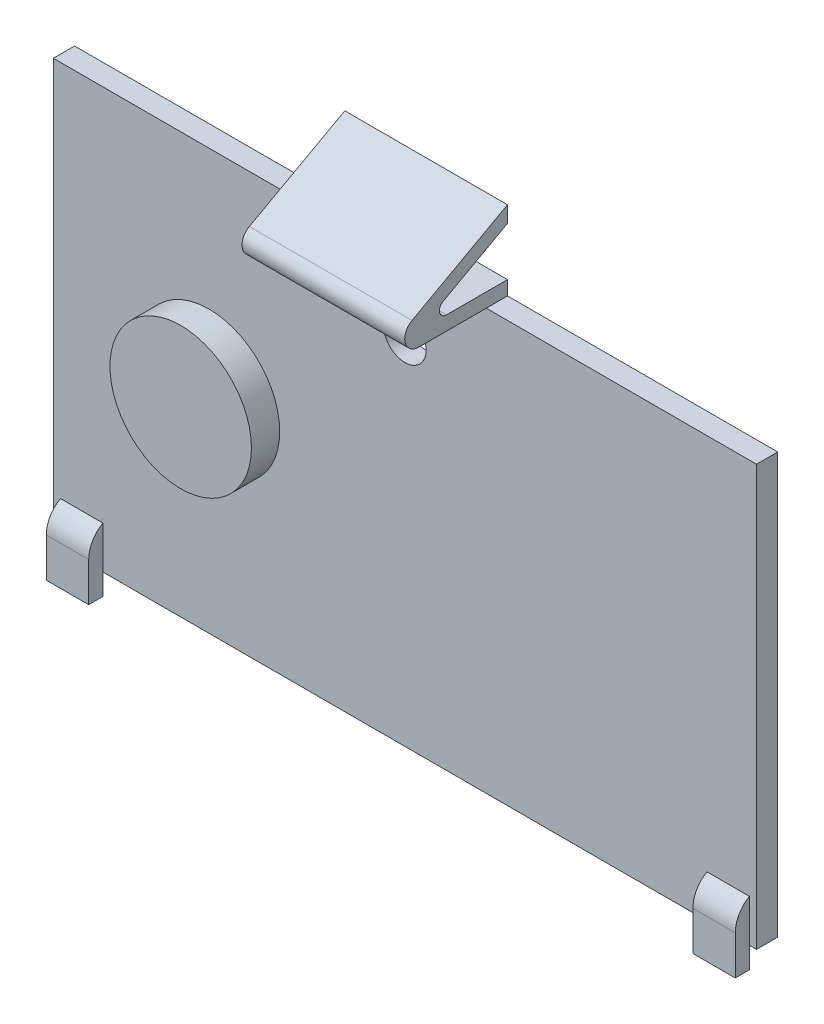
ISO-10303-21;
HEADER;
FILE_DESCRIPTION(('STEP AP214'),'2;1');
FILE_NAME('part.step','',(''),(''),'','','');
FILE_SCHEMA(('AUTOMOTIVE_DESIGN { 1 0 10303 214 1 1 1 1 }'));
ENDSEC;
DATA;
#1=APPLICATION_CONTEXT('core data for automotive mechanical design processes');
#2=APPLICATION_PROTOCOL_DEFINITION('international standard','automotive_design',2000,#1);
#3=PRODUCT_CONTEXT('',#1,'mechanical');
#4=PRODUCT('Part','Part','',(#3));
#5=PRODUCT_RELATED_PRODUCT_CATEGORY('part','',(#4));
#6=PRODUCT_DEFINITION_FORMATION('','',#4);
#7=PRODUCT_DEFINITION_CONTEXT('part definition',#1,'design');
#8=PRODUCT_DEFINITION('design','',#6,#7);
#9=PRODUCT_DEFINITION_SHAPE('','',#8);
#10=(LENGTH_UNIT() NAMED_UNIT(*) SI_UNIT(.MILLI.,.METRE.));
#11=(NAMED_UNIT(*) PLANE_ANGLE_UNIT() SI_UNIT($,.RADIAN.));
#12=(NAMED_UNIT(*) SI_UNIT($,.STERADIAN.) SOLID_ANGLE_UNIT());
#13=UNCERTAINTY_MEASURE_WITH_UNIT(LENGTH_MEASURE(1.E-05),#10,'distance_accuracy_value','');
#14=(GEOMETRIC_REPRESENTATION_CONTEXT(3) GLOBAL_UNCERTAINTY_ASSIGNED_CONTEXT((#13)) GLOBAL_UNIT_ASSIGNED_CONTEXT((#10,
#11,#12)) REPRESENTATION_CONTEXT('',''));
#15=CARTESIAN_POINT('',(0.,0.,0.));
#16=DIRECTION('',(0.,0.,1.));
#17=DIRECTION('',(1.,0.,0.));
#18=AXIS2_PLACEMENT_3D('',#15,#16,#17);
#19=CARTESIAN_POINT('',(-24.85,29.7,1.5));
#20=DIRECTION('',(0.,-1.,0.));
#21=DIRECTION('',(0.,0.,-1.));
#22=AXIS2_PLACEMENT_3D('',#19,#20,#21);
#23=PLANE('',#22);
#24=DIRECTION('',(0.,0.,-1.));
#25=VECTOR('',#24,1.);
#26=CARTESIAN_POINT('',(-5.75,29.7,0.));
#27=LINE('',#26,#25);
#28=CARTESIAN_POINT('',(-5.75,29.7,1.5));
#29=VERTEX_POINT('',#28);
#30=CARTESIAN_POINT('',(-5.75,29.7,0.));
#31=VERTEX_POINT('',#30);
#32=EDGE_CURVE('E529',#29,#31,#27,.T.);
#33=ORIENTED_EDGE('',*,*,#32,.T.);
#34=DIRECTION('',(-1.,0.,0.));
#35=VECTOR('',#34,1.);
#36=CARTESIAN_POINT('',(-24.85,29.7,0.));
#37=LINE('',#36,#35);
#38=CARTESIAN_POINT('',(-24.85,29.7,0.));
#39=VERTEX_POINT('',#38);
#40=EDGE_CURVE('E364',#31,#39,#37,.T.);
#41=ORIENTED_EDGE('',*,*,#40,.T.);
#42=DIRECTION('',(0.,0.,-1.));
#43=VECTOR('',#42,1.);
#44=CARTESIAN_POINT('',(-24.85,29.7,1.5));
#45=LINE('',#44,#43);
#46=CARTESIAN_POINT('',(-24.85,29.7,1.5));
#47=VERTEX_POINT('',#46);
#48=EDGE_CURVE('E354',#47,#39,#45,.T.);
#49=ORIENTED_EDGE('',*,*,#48,.F.);
#50=DIRECTION('',(-1.,0.,0.));
#51=VECTOR('',#50,1.);
#52=CARTESIAN_POINT('',(-24.85,29.7,1.5));
#53=LINE('',#52,#51);
#54=EDGE_CURVE('E61',#29,#47,#53,.T.);
#55=ORIENTED_EDGE('',*,*,#54,.F.);
#56=EDGE_LOOP('',(#33,#41,#49,#55));
#57=FACE_BOUND('',#56,.T.);
#58=ADVANCED_FACE('F45',(#57),#23,.F.);
#59=CARTESIAN_POINT('',(-24.85,0.,1.5));
#60=DIRECTION('',(0.,1.,0.));
#61=DIRECTION('',(0.,0.,1.));
#62=AXIS2_PLACEMENT_3D('',#59,#60,#61);
#63=PLANE('',#62);
#64=DIRECTION('',(1.,0.,0.));
#65=VECTOR('',#64,1.);
#66=CARTESIAN_POINT('',(-24.35,0.,1.5));
#67=LINE('',#66,#65);
#68=CARTESIAN_POINT('',(-24.35,0.,1.5));
#69=VERTEX_POINT('',#68);
#70=CARTESIAN_POINT('',(-21.35,0.,1.5));
#71=VERTEX_POINT('',#70);
#72=EDGE_CURVE('E244',#69,#71,#67,.T.);
#73=ORIENTED_EDGE('',*,*,#72,.F.);
#74=DIRECTION('',(1.,0.,0.));
#75=VECTOR('',#74,1.);
#76=CARTESIAN_POINT('',(-24.85,0.,1.5));
#77=LINE('',#76,#75);
#78=CARTESIAN_POINT('',(-24.85,0.,1.5));
#79=VERTEX_POINT('',#78);
#80=EDGE_CURVE('E343',#79,#69,#77,.T.);
#81=ORIENTED_EDGE('',*,*,#80,.F.);
#82=DIRECTION('',(0.,0.,-1.));
#83=VECTOR('',#82,1.);
#84=CARTESIAN_POINT('',(-24.85,0.,1.5));
#85=LINE('',#84,#83);
#86=CARTESIAN_POINT('',(-24.85,0.,0.));
#87=VERTEX_POINT('',#86);
#88=EDGE_CURVE('E378',#79,#87,#85,.T.);
#89=ORIENTED_EDGE('',*,*,#88,.T.);
#90=DIRECTION('',(1.,0.,0.));
#91=VECTOR('',#90,1.);
#92=CARTESIAN_POINT('',(-24.85,0.,0.));
#93=LINE('',#92,#91);
#94=CARTESIAN_POINT('',(24.85,0.,0.));
#95=VERTEX_POINT('',#94);
#96=EDGE_CURVE('E358',#87,#95,#93,.T.);
#97=ORIENTED_EDGE('',*,*,#96,.T.);
#98=DIRECTION('',(0.,0.,-1.));
#99=VECTOR('',#98,1.);
#100=CARTESIAN_POINT('',(24.85,0.,1.5));
#101=LINE('',#100,#99);
#102=CARTESIAN_POINT('',(24.85,0.,1.5));
#103=VERTEX_POINT('',#102);
#104=EDGE_CURVE('E374',#103,#95,#101,.T.);
#105=ORIENTED_EDGE('',*,*,#104,.F.);
#106=CARTESIAN_POINT('',(24.35,0.,1.5));
#107=VERTEX_POINT('',#106);
#108=EDGE_CURVE('E341',#107,#103,#77,.T.);
#109=ORIENTED_EDGE('',*,*,#108,.F.);
#110=DIRECTION('',(1.,0.,0.));
#111=VECTOR('',#110,1.);
#112=CARTESIAN_POINT('',(21.35,0.,1.5));
#113=LINE('',#112,#111);
#114=CARTESIAN_POINT('',(21.35,0.,1.5));
#115=VERTEX_POINT('',#114);
#116=EDGE_CURVE('E259',#115,#107,#113,.T.);
#117=ORIENTED_EDGE('',*,*,#116,.F.);
#118=EDGE_CURVE('E348',#71,#115,#77,.T.);
#119=ORIENTED_EDGE('',*,*,#118,.F.);
#120=EDGE_LOOP('',(#73,#81,#89,#97,#105,#109,#117,#119));
#121=FACE_BOUND('',#120,.T.);
#122=ADVANCED_FACE('F423',(#121),#63,.F.);
#123=CARTESIAN_POINT('',(0.,0.,1.5));
#124=DIRECTION('',(0.,0.,1.));
#125=DIRECTION('',(1.,0.,0.));
#126=AXIS2_PLACEMENT_3D('',#123,#124,#125);
#127=PLANE('',#126);
#128=CARTESIAN_POINT('',(0.,25.,1.5));
#129=DIRECTION('',(0.,0.,1.));
#130=DIRECTION('',(1.,0.,0.));
#131=AXIS2_PLACEMENT_3D('',#128,#129,#130);
#132=CIRCLE('',#131,1.5);
#133=CARTESIAN_POINT('',(1.5,25.,1.5));
#134=VERTEX_POINT('',#133);
#135=EDGE_CURVE('E511',#134,#134,#132,.T.);
#136=ORIENTED_EDGE('',*,*,#135,.F.);
#137=EDGE_LOOP('',(#136));
#138=FACE_BOUND('',#137,.T.);
#139=CARTESIAN_POINT('',(-13.85,14.85,1.5));
#140=DIRECTION('',(0.,0.,1.));
#141=DIRECTION('',(1.,0.,0.));
#142=AXIS2_PLACEMENT_3D('',#139,#140,#141);
#143=CIRCLE('',#142,5.);
#144=CARTESIAN_POINT('',(-8.85,14.85,1.5));
#145=VERTEX_POINT('',#144);
#146=EDGE_CURVE('E301',#145,#145,#143,.T.);
#147=ORIENTED_EDGE('',*,*,#146,.F.);
#148=EDGE_LOOP('',(#147));
#149=FACE_BOUND('',#148,.T.);
#150=ORIENTED_EDGE('',*,*,#80,.T.);
#151=DIRECTION('',(0.,-1.,0.));
#152=VECTOR('',#151,1.);
#153=CARTESIAN_POINT('',(-24.35,0.,1.5));
#154=LINE('',#153,#152);
#155=CARTESIAN_POINT('',(-24.35,3.,1.5));
#156=VERTEX_POINT('',#155);
#157=EDGE_CURVE('E302',#156,#69,#154,.T.);
#158=ORIENTED_EDGE('',*,*,#157,.F.);
#159=DIRECTION('',(-1.,0.,0.));
#160=VECTOR('',#159,1.);
#161=CARTESIAN_POINT('',(-24.35,3.,1.5));
#162=LINE('',#161,#160);
#163=CARTESIAN_POINT('',(-21.35,3.,1.5));
#164=VERTEX_POINT('',#163);
#165=EDGE_CURVE('E297',#164,#156,#162,.T.);
#166=ORIENTED_EDGE('',*,*,#165,.F.);
#167=DIRECTION('',(0.,1.,0.));
#168=VECTOR('',#167,1.);
#169=CARTESIAN_POINT('',(-21.35,0.,1.5));
#170=LINE('',#169,#168);
#171=EDGE_CURVE('E306',#71,#164,#170,.T.);
#172=ORIENTED_EDGE('',*,*,#171,.F.);
#173=ORIENTED_EDGE('',*,*,#118,.T.);
#174=DIRECTION('',(0.,-1.,0.));
#175=VECTOR('',#174,1.);
#176=CARTESIAN_POINT('',(21.35,0.,1.5));
#177=LINE('',#176,#175);
#178=CARTESIAN_POINT('',(21.35,3.,1.5));
#179=VERTEX_POINT('',#178);
#180=EDGE_CURVE('E307',#179,#115,#177,.T.);
#181=ORIENTED_EDGE('',*,*,#180,.F.);
#182=DIRECTION('',(-1.,0.,0.));
#183=VECTOR('',#182,1.);
#184=CARTESIAN_POINT('',(21.35,3.,1.5));
#185=LINE('',#184,#183);
#186=CARTESIAN_POINT('',(24.35,3.,1.5));
#187=VERTEX_POINT('',#186);
#188=EDGE_CURVE('E313',#187,#179,#185,.T.);
#189=ORIENTED_EDGE('',*,*,#188,.F.);
#190=DIRECTION('',(0.,1.,0.));
#191=VECTOR('',#190,1.);
#192=CARTESIAN_POINT('',(24.35,0.,1.5));
#193=LINE('',#192,#191);
#194=EDGE_CURVE('E317',#107,#187,#193,.T.);
#195=ORIENTED_EDGE('',*,*,#194,.F.);
#196=ORIENTED_EDGE('',*,*,#108,.T.);
#197=DIRECTION('',(0.,1.,0.));
#198=VECTOR('',#197,1.);
#199=CARTESIAN_POINT('',(24.85,29.7,1.5));
#200=LINE('',#199,#198);
#201=CARTESIAN_POINT('',(24.85,29.7,1.5));
#202=VERTEX_POINT('',#201);
#203=EDGE_CURVE('E347',#103,#202,#200,.T.);
#204=ORIENTED_EDGE('',*,*,#203,.T.);
#205=CARTESIAN_POINT('',(5.75,29.7,1.5));
#206=VERTEX_POINT('',#205);
#207=EDGE_CURVE('E351',#202,#206,#53,.T.);
#208=ORIENTED_EDGE('',*,*,#207,.T.);
#209=DIRECTION('',(-1.,0.,0.));
#210=VECTOR('',#209,1.);
#211=CARTESIAN_POINT('',(0.,29.7,1.5));
#212=LINE('',#211,#210);
#213=EDGE_CURVE('E229',#206,#29,#212,.T.);
#214=ORIENTED_EDGE('',*,*,#213,.T.);
#215=ORIENTED_EDGE('',*,*,#54,.T.);
#216=DIRECTION('',(0.,-1.,0.));
#217=VECTOR('',#216,1.);
#218=CARTESIAN_POINT('',(-24.85,29.7,1.5));
#219=LINE('',#218,#217);
#220=EDGE_CURVE('E337',#47,#79,#219,.T.);
#221=ORIENTED_EDGE('',*,*,#220,.T.);
#222=EDGE_LOOP('',(#150,#158,#166,#172,#173,#181,#189,#195,#196,#204,#208,#214,#215,#221));
#223=FACE_BOUND('',#222,.T.);
#224=ADVANCED_FACE('F407',(#138,#149,#223),#127,.T.);
#225=CARTESIAN_POINT('',(-24.85,29.7,1.5));
#226=DIRECTION('',(1.,0.,0.));
#227=DIRECTION('',(0.,0.,-1.));
#228=AXIS2_PLACEMENT_3D('',#225,#226,#227);
#229=PLANE('',#228);
#230=DIRECTION('',(0.,-1.,0.));
#231=VECTOR('',#230,1.);
#232=CARTESIAN_POINT('',(-24.85,29.7,0.));
#233=LINE('',#232,#231);
#234=EDGE_CURVE('E333',#39,#87,#233,.T.);
#235=ORIENTED_EDGE('',*,*,#234,.T.);
#236=ORIENTED_EDGE('',*,*,#88,.F.);
#237=ORIENTED_EDGE('',*,*,#220,.F.);
#238=ORIENTED_EDGE('',*,*,#48,.T.);
#239=EDGE_LOOP('',(#235,#236,#237,#238));
#240=FACE_BOUND('',#239,.T.);
#241=ADVANCED_FACE('F434',(#240),#229,.F.);
#242=CARTESIAN_POINT('',(24.85,29.7,1.5));
#243=DIRECTION('',(-1.,0.,0.));
#244=DIRECTION('',(0.,0.,1.));
#245=AXIS2_PLACEMENT_3D('',#242,#243,#244);
#246=PLANE('',#245);
#247=DIRECTION('',(0.,1.,0.));
#248=VECTOR('',#247,1.);
#249=CARTESIAN_POINT('',(24.85,29.7,0.));
#250=LINE('',#249,#248);
#251=CARTESIAN_POINT('',(24.85,29.7,0.));
#252=VERTEX_POINT('',#251);
#253=EDGE_CURVE('E361',#95,#252,#250,.T.);
#254=ORIENTED_EDGE('',*,*,#253,.T.);
#255=DIRECTION('',(0.,0.,-1.));
#256=VECTOR('',#255,1.);
#257=CARTESIAN_POINT('',(24.85,29.7,1.5));
#258=LINE('',#257,#256);
#259=EDGE_CURVE('E370',#202,#252,#258,.T.);
#260=ORIENTED_EDGE('',*,*,#259,.F.);
#261=ORIENTED_EDGE('',*,*,#203,.F.);
#262=ORIENTED_EDGE('',*,*,#104,.T.);
#263=EDGE_LOOP('',(#254,#260,#261,#262));
#264=FACE_BOUND('',#263,.T.);
#265=ADVANCED_FACE('F477',(#264),#246,.F.);
#266=CARTESIAN_POINT('',(5.75,29.7,0.));
#267=VERTEX_POINT('',#266);
#268=EDGE_CURVE('E342',#252,#267,#37,.T.);
#269=ORIENTED_EDGE('',*,*,#268,.T.);
#270=DIRECTION('',(0.,0.,-1.));
#271=VECTOR('',#270,1.);
#272=CARTESIAN_POINT('',(5.75,29.7,0.));
#273=LINE('',#272,#271);
#274=EDGE_CURVE('E69',#206,#267,#273,.T.);
#275=ORIENTED_EDGE('',*,*,#274,.F.);
#276=ORIENTED_EDGE('',*,*,#207,.F.);
#277=ORIENTED_EDGE('',*,*,#259,.T.);
#278=EDGE_LOOP('',(#269,#275,#276,#277));
#279=FACE_BOUND('',#278,.T.);
#280=ADVANCED_FACE('F468',(#279),#23,.F.);
#281=CARTESIAN_POINT('',(0.,0.,0.));
#282=DIRECTION('',(0.,0.,1.));
#283=DIRECTION('',(1.,0.,0.));
#284=AXIS2_PLACEMENT_3D('',#281,#282,#283);
#285=PLANE('',#284);
#286=CARTESIAN_POINT('',(0.,25.,0.));
#287=DIRECTION('',(0.,0.,-1.));
#288=DIRECTION('',(-1.,0.,0.));
#289=AXIS2_PLACEMENT_3D('',#286,#287,#288);
#290=CIRCLE('',#289,1.5);
#291=CARTESIAN_POINT('',(-1.5,25.,0.));
#292=VERTEX_POINT('',#291);
#293=EDGE_CURVE('E580',#292,#292,#290,.T.);
#294=ORIENTED_EDGE('',*,*,#293,.F.);
#295=EDGE_LOOP('',(#294));
#296=FACE_BOUND('',#295,.T.);
#297=ORIENTED_EDGE('',*,*,#234,.F.);
#298=ORIENTED_EDGE('',*,*,#40,.F.);
#299=DIRECTION('',(0.,1.,0.));
#300=VECTOR('',#299,1.);
#301=CARTESIAN_POINT('',(-5.75,30.7,0.));
#302=LINE('',#301,#300);
#303=CARTESIAN_POINT('',(-5.75,30.7,0.));
#304=VERTEX_POINT('',#303);
#305=EDGE_CURVE('E227',#31,#304,#302,.T.);
#306=ORIENTED_EDGE('',*,*,#305,.T.);
#307=DIRECTION('',(-1.,0.,0.));
#308=VECTOR('',#307,1.);
#309=CARTESIAN_POINT('',(5.75,30.7,0.));
#310=LINE('',#309,#308);
#311=CARTESIAN_POINT('',(5.75,30.7,0.));
#312=VERTEX_POINT('',#311);
#313=EDGE_CURVE('E206',#312,#304,#310,.T.);
#314=ORIENTED_EDGE('',*,*,#313,.F.);
#315=DIRECTION('',(0.,1.,0.));
#316=VECTOR('',#315,1.);
#317=CARTESIAN_POINT('',(5.75,30.7,0.));
#318=LINE('',#317,#316);
#319=EDGE_CURVE('E214',#267,#312,#318,.T.);
#320=ORIENTED_EDGE('',*,*,#319,.F.);
#321=ORIENTED_EDGE('',*,*,#268,.F.);
#322=ORIENTED_EDGE('',*,*,#253,.F.);
#323=ORIENTED_EDGE('',*,*,#96,.F.);
#324=EDGE_LOOP('',(#297,#298,#306,#314,#320,#321,#322,#323));
#325=FACE_BOUND('',#324,.T.);
#326=ADVANCED_FACE('F225',(#296,#325),#285,.F.);
#327=CARTESIAN_POINT('',(-13.85,14.85,3.5));
#328=DIRECTION('',(0.,0.,-1.));
#329=DIRECTION('',(-1.,0.,0.));
#330=AXIS2_PLACEMENT_3D('',#327,#328,#329);
#331=CYLINDRICAL_SURFACE('',#330,5.);
#332=CARTESIAN_POINT('',(-13.85,14.85,3.5));
#333=DIRECTION('',(0.,0.,1.));
#334=DIRECTION('',(1.,0.,0.));
#335=AXIS2_PLACEMENT_3D('',#332,#333,#334);
#336=CIRCLE('',#335,5.);
#337=CARTESIAN_POINT('',(-8.85,14.85,3.5));
#338=VERTEX_POINT('',#337);
#339=EDGE_CURVE('E329',#338,#338,#336,.T.);
#340=ORIENTED_EDGE('',*,*,#339,.F.);
#341=EDGE_LOOP('',(#340));
#342=FACE_BOUND('',#341,.T.);
#343=ORIENTED_EDGE('',*,*,#146,.T.);
#344=EDGE_LOOP('',(#343));
#345=FACE_BOUND('',#344,.T.);
#346=ADVANCED_FACE('F482',(#342,#345),#331,.T.);
#347=CARTESIAN_POINT('',(-13.85,14.85,3.5));
#348=DIRECTION('',(0.,0.,1.));
#349=DIRECTION('',(1.,0.,0.));
#350=AXIS2_PLACEMENT_3D('',#347,#348,#349);
#351=PLANE('',#350);
#352=ORIENTED_EDGE('',*,*,#339,.T.);
#353=EDGE_LOOP('',(#352));
#354=FACE_BOUND('',#353,.T.);
#355=ADVANCED_FACE('F661',(#354),#351,.T.);
#356=CARTESIAN_POINT('',(21.35,0.,2.5));
#357=DIRECTION('',(1.,0.,0.));
#358=DIRECTION('',(0.,0.,-1.));
#359=AXIS2_PLACEMENT_3D('',#356,#357,#358);
#360=PLANE('',#359);
#361=DIRECTION('',(0.,-1.,0.));
#362=VECTOR('',#361,1.);
#363=CARTESIAN_POINT('',(21.35,0.,2.5));
#364=LINE('',#363,#362);
#365=CARTESIAN_POINT('',(21.35,1.26794919243112,2.5));
#366=VERTEX_POINT('',#365);
#367=CARTESIAN_POINT('',(21.35,-1.5,2.5));
#368=VERTEX_POINT('',#367);
#369=EDGE_CURVE('E318',#366,#368,#364,.T.);
#370=ORIENTED_EDGE('',*,*,#369,.F.);
#371=CARTESIAN_POINT('',(21.35,1.26794919243112,0.5));
#372=DIRECTION('',(1.,0.,0.));
#373=DIRECTION('',(0.,0.,-1.));
#374=AXIS2_PLACEMENT_3D('',#371,#372,#373);
#375=CIRCLE('',#374,2.);
#376=EDGE_CURVE('E54',#366,#179,#375,.F.);
#377=ORIENTED_EDGE('',*,*,#376,.T.);
#378=ORIENTED_EDGE('',*,*,#180,.T.);
#379=DIRECTION('',(0.,1.,0.));
#380=VECTOR('',#379,1.);
#381=CARTESIAN_POINT('',(21.35,-1.5,1.5));
#382=LINE('',#381,#380);
#383=CARTESIAN_POINT('',(21.35,-1.5,1.5));
#384=VERTEX_POINT('',#383);
#385=EDGE_CURVE('E233',#384,#115,#382,.T.);
#386=ORIENTED_EDGE('',*,*,#385,.F.);
#387=DIRECTION('',(0.,0.,-1.));
#388=VECTOR('',#387,1.);
#389=CARTESIAN_POINT('',(21.35,-1.5,2.5));
#390=LINE('',#389,#388);
#391=EDGE_CURVE('E279',#368,#384,#390,.T.);
#392=ORIENTED_EDGE('',*,*,#391,.F.);
#393=EDGE_LOOP('',(#370,#377,#378,#386,#392));
#394=FACE_BOUND('',#393,.T.);
#395=ADVANCED_FACE('F399',(#394),#360,.F.);
#396=CARTESIAN_POINT('',(24.35,0.,2.5));
#397=DIRECTION('',(-1.,0.,0.));
#398=DIRECTION('',(0.,0.,1.));
#399=AXIS2_PLACEMENT_3D('',#396,#397,#398);
#400=PLANE('',#399);
#401=ORIENTED_EDGE('',*,*,#194,.T.);
#402=CARTESIAN_POINT('',(24.35,1.26794919243112,0.5));
#403=DIRECTION('',(-1.,0.,0.));
#404=DIRECTION('',(0.,0.,1.));
#405=AXIS2_PLACEMENT_3D('',#402,#403,#404);
#406=CIRCLE('',#405,2.);
#407=CARTESIAN_POINT('',(24.35,1.26794919243112,2.5));
#408=VERTEX_POINT('',#407);
#409=EDGE_CURVE('E11',#187,#408,#406,.F.);
#410=ORIENTED_EDGE('',*,*,#409,.T.);
#411=DIRECTION('',(0.,1.,0.));
#412=VECTOR('',#411,1.);
#413=CARTESIAN_POINT('',(24.35,0.,2.5));
#414=LINE('',#413,#412);
#415=CARTESIAN_POINT('',(24.35,-1.5,2.5));
#416=VERTEX_POINT('',#415);
#417=EDGE_CURVE('E267',#416,#408,#414,.T.);
#418=ORIENTED_EDGE('',*,*,#417,.F.);
#419=DIRECTION('',(0.,0.,1.));
#420=VECTOR('',#419,1.);
#421=CARTESIAN_POINT('',(24.35,-1.5,2.5));
#422=LINE('',#421,#420);
#423=CARTESIAN_POINT('',(24.35,-1.5,1.5));
#424=VERTEX_POINT('',#423);
#425=EDGE_CURVE('E283',#424,#416,#422,.T.);
#426=ORIENTED_EDGE('',*,*,#425,.F.);
#427=DIRECTION('',(0.,1.,0.));
#428=VECTOR('',#427,1.);
#429=CARTESIAN_POINT('',(24.35,-1.5,1.5));
#430=LINE('',#429,#428);
#431=EDGE_CURVE('E271',#424,#107,#430,.T.);
#432=ORIENTED_EDGE('',*,*,#431,.T.);
#433=EDGE_LOOP('',(#401,#410,#418,#426,#432));
#434=FACE_BOUND('',#433,.T.);
#435=ADVANCED_FACE('F412',(#434),#400,.F.);
#436=CARTESIAN_POINT('',(0.,0.,2.5));
#437=DIRECTION('',(0.,0.,-1.));
#438=DIRECTION('',(-1.,0.,0.));
#439=AXIS2_PLACEMENT_3D('',#436,#437,#438);
#440=PLANE('',#439);
#441=ORIENTED_EDGE('',*,*,#417,.T.);
#442=DIRECTION('',(-1.,0.,0.));
#443=VECTOR('',#442,1.);
#444=CARTESIAN_POINT('',(0.,1.26794919243112,2.5));
#445=LINE('',#444,#443);
#446=EDGE_CURVE('E392',#408,#366,#445,.T.);
#447=ORIENTED_EDGE('',*,*,#446,.T.);
#448=ORIENTED_EDGE('',*,*,#369,.T.);
#449=DIRECTION('',(-1.,0.,0.));
#450=VECTOR('',#449,1.);
#451=CARTESIAN_POINT('',(21.35,-1.5,2.5));
#452=LINE('',#451,#450);
#453=EDGE_CURVE('E275',#416,#368,#452,.T.);
#454=ORIENTED_EDGE('',*,*,#453,.F.);
#455=EDGE_LOOP('',(#441,#447,#448,#454));
#456=FACE_BOUND('',#455,.T.);
#457=ADVANCED_FACE('F416',(#456),#440,.F.);
#458=CARTESIAN_POINT('',(-24.35,0.,2.5));
#459=DIRECTION('',(1.,0.,0.));
#460=DIRECTION('',(0.,0.,-1.));
#461=AXIS2_PLACEMENT_3D('',#458,#459,#460);
#462=PLANE('',#461);
#463=DIRECTION('',(0.,-1.,0.));
#464=VECTOR('',#463,1.);
#465=CARTESIAN_POINT('',(-24.35,0.,2.5));
#466=LINE('',#465,#464);
#467=CARTESIAN_POINT('',(-24.35,1.26794919243112,2.5));
#468=VERTEX_POINT('',#467);
#469=CARTESIAN_POINT('',(-24.35,-1.5,2.5));
#470=VERTEX_POINT('',#469);
#471=EDGE_CURVE('E293',#468,#470,#466,.T.);
#472=ORIENTED_EDGE('',*,*,#471,.F.);
#473=CARTESIAN_POINT('',(-24.35,1.26794919243112,0.5));
#474=DIRECTION('',(1.,0.,0.));
#475=DIRECTION('',(0.,0.,-1.));
#476=AXIS2_PLACEMENT_3D('',#473,#474,#475);
#477=CIRCLE('',#476,2.);
#478=EDGE_CURVE('E386',#468,#156,#477,.F.);
#479=ORIENTED_EDGE('',*,*,#478,.T.);
#480=ORIENTED_EDGE('',*,*,#157,.T.);
#481=DIRECTION('',(0.,1.,0.));
#482=VECTOR('',#481,1.);
#483=CARTESIAN_POINT('',(-24.35,-1.5,1.5));
#484=LINE('',#483,#482);
#485=CARTESIAN_POINT('',(-24.35,-1.5,1.5));
#486=VERTEX_POINT('',#485);
#487=EDGE_CURVE('E263',#486,#69,#484,.T.);
#488=ORIENTED_EDGE('',*,*,#487,.F.);
#489=DIRECTION('',(0.,0.,-1.));
#490=VECTOR('',#489,1.);
#491=CARTESIAN_POINT('',(-24.35,-1.5,2.5));
#492=LINE('',#491,#490);
#493=EDGE_CURVE('E239',#470,#486,#492,.T.);
#494=ORIENTED_EDGE('',*,*,#493,.F.);
#495=EDGE_LOOP('',(#472,#479,#480,#488,#494));
#496=FACE_BOUND('',#495,.T.);
#497=ADVANCED_FACE('F444',(#496),#462,.F.);
#498=CARTESIAN_POINT('',(-21.35,0.,2.5));
#499=DIRECTION('',(-1.,0.,0.));
#500=DIRECTION('',(0.,0.,1.));
#501=AXIS2_PLACEMENT_3D('',#498,#499,#500);
#502=PLANE('',#501);
#503=ORIENTED_EDGE('',*,*,#171,.T.);
#504=CARTESIAN_POINT('',(-21.35,1.26794919243112,0.5));
#505=DIRECTION('',(-1.,0.,0.));
#506=DIRECTION('',(0.,0.,1.));
#507=AXIS2_PLACEMENT_3D('',#504,#505,#506);
#508=CIRCLE('',#507,2.);
#509=CARTESIAN_POINT('',(-21.35,1.26794919243112,2.5));
#510=VERTEX_POINT('',#509);
#511=EDGE_CURVE('E389',#164,#510,#508,.F.);
#512=ORIENTED_EDGE('',*,*,#511,.T.);
#513=DIRECTION('',(0.,1.,0.));
#514=VECTOR('',#513,1.);
#515=CARTESIAN_POINT('',(-21.35,0.,2.5));
#516=LINE('',#515,#514);
#517=CARTESIAN_POINT('',(-21.35,-1.5,2.5));
#518=VERTEX_POINT('',#517);
#519=EDGE_CURVE('E296',#518,#510,#516,.T.);
#520=ORIENTED_EDGE('',*,*,#519,.F.);
#521=DIRECTION('',(0.,0.,1.));
#522=VECTOR('',#521,1.);
#523=CARTESIAN_POINT('',(-21.35,-1.5,2.5));
#524=LINE('',#523,#522);
#525=CARTESIAN_POINT('',(-21.35,-1.5,1.5));
#526=VERTEX_POINT('',#525);
#527=EDGE_CURVE('E247',#526,#518,#524,.T.);
#528=ORIENTED_EDGE('',*,*,#527,.F.);
#529=DIRECTION('',(0.,1.,0.));
#530=VECTOR('',#529,1.);
#531=CARTESIAN_POINT('',(-21.35,-1.5,1.5));
#532=LINE('',#531,#530);
#533=EDGE_CURVE('E255',#526,#71,#532,.T.);
#534=ORIENTED_EDGE('',*,*,#533,.T.);
#535=EDGE_LOOP('',(#503,#512,#520,#528,#534));
#536=FACE_BOUND('',#535,.T.);
#537=ADVANCED_FACE('F454',(#536),#502,.F.);
#538=CARTESIAN_POINT('',(0.,0.,2.5));
#539=DIRECTION('',(0.,0.,-1.));
#540=DIRECTION('',(-1.,0.,0.));
#541=AXIS2_PLACEMENT_3D('',#538,#539,#540);
#542=PLANE('',#541);
#543=ORIENTED_EDGE('',*,*,#519,.T.);
#544=DIRECTION('',(-1.,0.,0.));
#545=VECTOR('',#544,1.);
#546=CARTESIAN_POINT('',(0.,1.26794919243112,2.5));
#547=LINE('',#546,#545);
#548=EDGE_CURVE('E382',#510,#468,#547,.T.);
#549=ORIENTED_EDGE('',*,*,#548,.T.);
#550=ORIENTED_EDGE('',*,*,#471,.T.);
#551=DIRECTION('',(-1.,0.,0.));
#552=VECTOR('',#551,1.);
#553=CARTESIAN_POINT('',(-24.35,-1.5,2.5));
#554=LINE('',#553,#552);
#555=EDGE_CURVE('E251',#518,#470,#554,.T.);
#556=ORIENTED_EDGE('',*,*,#555,.F.);
#557=EDGE_LOOP('',(#543,#549,#550,#556));
#558=FACE_BOUND('',#557,.T.);
#559=ADVANCED_FACE('F450',(#558),#542,.F.);
#560=CARTESIAN_POINT('',(21.35,-1.5,1.5));
#561=DIRECTION('',(0.,0.,1.));
#562=DIRECTION('',(1.,0.,0.));
#563=AXIS2_PLACEMENT_3D('',#560,#561,#562);
#564=PLANE('',#563);
#565=ORIENTED_EDGE('',*,*,#116,.T.);
#566=ORIENTED_EDGE('',*,*,#431,.F.);
#567=DIRECTION('',(1.,0.,0.));
#568=VECTOR('',#567,1.);
#569=CARTESIAN_POINT('',(21.35,-1.5,1.5));
#570=LINE('',#569,#568);
#571=EDGE_CURVE('E287',#384,#424,#570,.T.);
#572=ORIENTED_EDGE('',*,*,#571,.F.);
#573=ORIENTED_EDGE('',*,*,#385,.T.);
#574=EDGE_LOOP('',(#565,#566,#572,#573));
#575=FACE_BOUND('',#574,.T.);
#576=ADVANCED_FACE('F420',(#575),#564,.F.);
#577=CARTESIAN_POINT('',(0.,-1.5,0.));
#578=DIRECTION('',(0.,-1.,0.));
#579=DIRECTION('',(0.,0.,-1.));
#580=AXIS2_PLACEMENT_3D('',#577,#578,#579);
#581=PLANE('',#580);
#582=ORIENTED_EDGE('',*,*,#391,.T.);
#583=ORIENTED_EDGE('',*,*,#571,.T.);
#584=ORIENTED_EDGE('',*,*,#425,.T.);
#585=ORIENTED_EDGE('',*,*,#453,.T.);
#586=EDGE_LOOP('',(#582,#583,#584,#585));
#587=FACE_BOUND('',#586,.T.);
#588=ADVANCED_FACE('F418',(#587),#581,.T.);
#589=CARTESIAN_POINT('',(-24.35,-1.5,1.5));
#590=DIRECTION('',(0.,0.,1.));
#591=DIRECTION('',(1.,0.,0.));
#592=AXIS2_PLACEMENT_3D('',#589,#590,#591);
#593=PLANE('',#592);
#594=ORIENTED_EDGE('',*,*,#72,.T.);
#595=ORIENTED_EDGE('',*,*,#533,.F.);
#596=DIRECTION('',(1.,0.,0.));
#597=VECTOR('',#596,1.);
#598=CARTESIAN_POINT('',(-24.35,-1.5,1.5));
#599=LINE('',#598,#597);
#600=EDGE_CURVE('E243',#486,#526,#599,.T.);
#601=ORIENTED_EDGE('',*,*,#600,.F.);
#602=ORIENTED_EDGE('',*,*,#487,.T.);
#603=EDGE_LOOP('',(#594,#595,#601,#602));
#604=FACE_BOUND('',#603,.T.);
#605=ADVANCED_FACE('F439',(#604),#593,.F.);
#606=CARTESIAN_POINT('',(0.,-1.5,0.));
#607=DIRECTION('',(0.,-1.,0.));
#608=DIRECTION('',(0.,0.,-1.));
#609=AXIS2_PLACEMENT_3D('',#606,#607,#608);
#610=PLANE('',#609);
#611=ORIENTED_EDGE('',*,*,#493,.T.);
#612=ORIENTED_EDGE('',*,*,#600,.T.);
#613=ORIENTED_EDGE('',*,*,#527,.T.);
#614=ORIENTED_EDGE('',*,*,#555,.T.);
#615=EDGE_LOOP('',(#611,#612,#613,#614));
#616=FACE_BOUND('',#615,.T.);
#617=ADVANCED_FACE('F456',(#616),#610,.T.);
#618=CARTESIAN_POINT('',(-24.35,1.26794919243112,0.5));
#619=DIRECTION('',(-1.,0.,0.));
#620=DIRECTION('',(0.,0.,1.));
#621=AXIS2_PLACEMENT_3D('',#618,#619,#620);
#622=CYLINDRICAL_SURFACE('',#621,2.);
#623=ORIENTED_EDGE('',*,*,#511,.F.);
#624=ORIENTED_EDGE('',*,*,#165,.T.);
#625=ORIENTED_EDGE('',*,*,#478,.F.);
#626=ORIENTED_EDGE('',*,*,#548,.F.);
#627=EDGE_LOOP('',(#623,#624,#625,#626));
#628=FACE_BOUND('',#627,.T.);
#629=ADVANCED_FACE('F448',(#628),#622,.T.);
#630=CARTESIAN_POINT('',(21.35,1.26794919243112,0.5));
#631=DIRECTION('',(-1.,0.,0.));
#632=DIRECTION('',(0.,0.,1.));
#633=AXIS2_PLACEMENT_3D('',#630,#631,#632);
#634=CYLINDRICAL_SURFACE('',#633,2.);
#635=ORIENTED_EDGE('',*,*,#409,.F.);
#636=ORIENTED_EDGE('',*,*,#188,.T.);
#637=ORIENTED_EDGE('',*,*,#376,.F.);
#638=ORIENTED_EDGE('',*,*,#446,.F.);
#639=EDGE_LOOP('',(#635,#636,#637,#638));
#640=FACE_BOUND('',#639,.T.);
#641=ADVANCED_FACE('F47',(#640),#634,.T.);
#642=CARTESIAN_POINT('',(5.75,30.7,4.31665863516004));
#643=DIRECTION('',(0.,-1.,0.));
#644=DIRECTION('',(0.,0.,-1.));
#645=AXIS2_PLACEMENT_3D('',#642,#643,#644);
#646=PLANE('',#645);
#647=DIRECTION('',(0.,0.,1.));
#648=VECTOR('',#647,1.);
#649=CARTESIAN_POINT('',(-5.75,30.7,4.31665863516004));
#650=LINE('',#649,#648);
#651=CARTESIAN_POINT('',(-5.75,30.7,4.31665863516004));
#652=VERTEX_POINT('',#651);
#653=EDGE_CURVE('E510',#304,#652,#650,.T.);
#654=ORIENTED_EDGE('',*,*,#653,.T.);
#655=DIRECTION('',(-1.,0.,0.));
#656=VECTOR('',#655,1.);
#657=CARTESIAN_POINT('',(5.75,30.7,4.31665863516004));
#658=LINE('',#657,#656);
#659=CARTESIAN_POINT('',(5.75,30.7,4.31665863516004));
#660=VERTEX_POINT('',#659);
#661=EDGE_CURVE('E209',#660,#652,#658,.T.);
#662=ORIENTED_EDGE('',*,*,#661,.F.);
#663=DIRECTION('',(0.,0.,1.));
#664=VECTOR('',#663,1.);
#665=CARTESIAN_POINT('',(5.75,30.7,4.31665863516004));
#666=LINE('',#665,#664);
#667=EDGE_CURVE('E202',#312,#660,#666,.T.);
#668=ORIENTED_EDGE('',*,*,#667,.F.);
#669=ORIENTED_EDGE('',*,*,#313,.T.);
#670=EDGE_LOOP('',(#654,#662,#668,#669));
#671=FACE_BOUND('',#670,.T.);
#672=ADVANCED_FACE('F204',(#671),#646,.F.);
#673=CARTESIAN_POINT('',(5.75,31.2,4.31665863516004));
#674=DIRECTION('',(-1.,0.,0.));
#675=DIRECTION('',(0.,0.,1.));
#676=AXIS2_PLACEMENT_3D('',#673,#674,#675);
#677=CYLINDRICAL_SURFACE('',#676,0.499999999999994);
#678=CARTESIAN_POINT('',(-5.75,31.2,4.31665863516004));
#679=DIRECTION('',(-1.,0.,0.));
#680=DIRECTION('',(0.,0.,1.));
#681=AXIS2_PLACEMENT_3D('',#678,#679,#680);
#682=CIRCLE('',#681,0.499999999999994);
#683=CARTESIAN_POINT('',(-5.75,31.6382342401506,4.55738825685124));
#684=VERTEX_POINT('',#683);
#685=EDGE_CURVE('E514',#652,#684,#682,.T.);
#686=ORIENTED_EDGE('',*,*,#685,.T.);
#687=DIRECTION('',(-1.,0.,0.));
#688=VECTOR('',#687,1.);
#689=CARTESIAN_POINT('',(5.75,31.6382342401506,4.55738825685124));
#690=LINE('',#689,#688);
#691=CARTESIAN_POINT('',(5.75,31.6382342401506,4.55738825685124));
#692=VERTEX_POINT('',#691);
#693=EDGE_CURVE('E235',#692,#684,#690,.T.);
#694=ORIENTED_EDGE('',*,*,#693,.F.);
#695=CARTESIAN_POINT('',(5.75,31.2,4.31665863516004));
#696=DIRECTION('',(-1.,0.,0.));
#697=DIRECTION('',(0.,0.,1.));
#698=AXIS2_PLACEMENT_3D('',#695,#696,#697);
#699=CIRCLE('',#698,0.499999999999994);
#700=EDGE_CURVE('E213',#660,#692,#699,.T.);
#701=ORIENTED_EDGE('',*,*,#700,.F.);
#702=ORIENTED_EDGE('',*,*,#661,.T.);
#703=EDGE_LOOP('',(#686,#694,#701,#702));
#704=FACE_BOUND('',#703,.T.);
#705=ADVANCED_FACE('F608',(#704),#677,.F.);
#706=CARTESIAN_POINT('',(5.75,34.1416861625623,0.));
#707=DIRECTION('',(0.,0.876468480301285,0.481459243382404));
#708=DIRECTION('',(0.,-0.481459243382404,0.876468480301285));
#709=AXIS2_PLACEMENT_3D('',#706,#707,#708);
#710=PLANE('',#709);
#711=DIRECTION('',(0.,0.481459243382404,-0.876468480301284));
#712=VECTOR('',#711,1.);
#713=CARTESIAN_POINT('',(-5.75,34.1416861625623,0.));
#714=LINE('',#713,#712);
#715=CARTESIAN_POINT('',(-5.75,34.1416861625623,0.));
#716=VERTEX_POINT('',#715);
#717=EDGE_CURVE('E517',#684,#716,#714,.T.);
#718=ORIENTED_EDGE('',*,*,#717,.T.);
#719=DIRECTION('',(-1.,0.,0.));
#720=VECTOR('',#719,1.);
#721=CARTESIAN_POINT('',(5.75,34.1416861625623,0.));
#722=LINE('',#721,#720);
#723=CARTESIAN_POINT('',(5.75,34.1416861625623,0.));
#724=VERTEX_POINT('',#723);
#725=EDGE_CURVE('E539',#724,#716,#722,.T.);
#726=ORIENTED_EDGE('',*,*,#725,.F.);
#727=DIRECTION('',(0.,0.481459243382404,-0.876468480301284));
#728=VECTOR('',#727,1.);
#729=CARTESIAN_POINT('',(5.75,34.1416861625623,0.));
#730=LINE('',#729,#728);
#731=EDGE_CURVE('E550',#692,#724,#730,.T.);
#732=ORIENTED_EDGE('',*,*,#731,.F.);
#733=ORIENTED_EDGE('',*,*,#693,.T.);
#734=EDGE_LOOP('',(#718,#726,#732,#733));
#735=FACE_BOUND('',#734,.T.);
#736=ADVANCED_FACE('F548',(#735),#710,.F.);
#737=CARTESIAN_POINT('',(5.75,35.282628503873,0.));
#738=DIRECTION('',(0.,0.,1.));
#739=DIRECTION('',(1.,0.,0.));
#740=AXIS2_PLACEMENT_3D('',#737,#738,#739);
#741=PLANE('',#740);
#742=DIRECTION('',(0.,1.,0.));
#743=VECTOR('',#742,1.);
#744=CARTESIAN_POINT('',(-5.75,35.282628503873,0.));
#745=LINE('',#744,#743);
#746=CARTESIAN_POINT('',(-5.75,35.282628503873,0.));
#747=VERTEX_POINT('',#746);
#748=EDGE_CURVE('E520',#716,#747,#745,.T.);
#749=ORIENTED_EDGE('',*,*,#748,.T.);
#750=DIRECTION('',(-1.,0.,0.));
#751=VECTOR('',#750,1.);
#752=CARTESIAN_POINT('',(5.75,35.282628503873,0.));
#753=LINE('',#752,#751);
#754=CARTESIAN_POINT('',(5.75,35.282628503873,0.));
#755=VERTEX_POINT('',#754);
#756=EDGE_CURVE('E535',#755,#747,#753,.T.);
#757=ORIENTED_EDGE('',*,*,#756,.F.);
#758=DIRECTION('',(0.,1.,0.));
#759=VECTOR('',#758,1.);
#760=CARTESIAN_POINT('',(5.75,35.282628503873,0.));
#761=LINE('',#760,#759);
#762=EDGE_CURVE('E568',#724,#755,#761,.T.);
#763=ORIENTED_EDGE('',*,*,#762,.F.);
#764=ORIENTED_EDGE('',*,*,#725,.T.);
#765=EDGE_LOOP('',(#749,#757,#763,#764));
#766=FACE_BOUND('',#765,.T.);
#767=ADVANCED_FACE('F560',(#766),#741,.F.);
#768=CARTESIAN_POINT('',(5.75,31.5764684803013,6.7468482291309));
#769=DIRECTION('',(0.,-0.876468480301285,-0.481459243382402));
#770=DIRECTION('',(0.,0.481459243382402,-0.876468480301286));
#771=AXIS2_PLACEMENT_3D('',#768,#769,#770);
#772=PLANE('',#771);
#773=DIRECTION('',(0.,-0.481459243382402,0.876468480301285));
#774=VECTOR('',#773,1.);
#775=CARTESIAN_POINT('',(-5.75,31.5764684803013,6.7468482291309));
#776=LINE('',#775,#774);
#777=CARTESIAN_POINT('',(-5.75,31.5764684803013,6.7468482291309));
#778=VERTEX_POINT('',#777);
#779=EDGE_CURVE('E523',#747,#778,#776,.T.);
#780=ORIENTED_EDGE('',*,*,#779,.T.);
#781=DIRECTION('',(-1.,0.,0.));
#782=VECTOR('',#781,1.);
#783=CARTESIAN_POINT('',(5.75,31.5764684803013,6.7468482291309));
#784=LINE('',#783,#782);
#785=CARTESIAN_POINT('',(5.75,31.5764684803013,6.7468482291309));
#786=VERTEX_POINT('',#785);
#787=EDGE_CURVE('E503',#786,#778,#784,.T.);
#788=ORIENTED_EDGE('',*,*,#787,.F.);
#789=DIRECTION('',(0.,-0.481459243382402,0.876468480301285));
#790=VECTOR('',#789,1.);
#791=CARTESIAN_POINT('',(5.75,31.5764684803013,6.7468482291309));
#792=LINE('',#791,#790);
#793=EDGE_CURVE('E566',#755,#786,#792,.T.);
#794=ORIENTED_EDGE('',*,*,#793,.F.);
#795=ORIENTED_EDGE('',*,*,#756,.T.);
#796=EDGE_LOOP('',(#780,#788,#794,#795));
#797=FACE_BOUND('',#796,.T.);
#798=ADVANCED_FACE('F564',(#797),#772,.F.);
#799=CARTESIAN_POINT('',(5.75,30.7,6.2653889857485));
#800=DIRECTION('',(-1.,0.,0.));
#801=DIRECTION('',(0.,0.,1.));
#802=AXIS2_PLACEMENT_3D('',#799,#800,#801);
#803=CYLINDRICAL_SURFACE('',#802,1.);
#804=CARTESIAN_POINT('',(-5.75,30.7,6.2653889857485));
#805=DIRECTION('',(1.,0.,0.));
#806=DIRECTION('',(0.,0.,-1.));
#807=AXIS2_PLACEMENT_3D('',#804,#805,#806);
#808=CIRCLE('',#807,1.);
#809=CARTESIAN_POINT('',(-5.75,29.7,6.26538898574848));
#810=VERTEX_POINT('',#809);
#811=EDGE_CURVE('E526',#778,#810,#808,.T.);
#812=ORIENTED_EDGE('',*,*,#811,.T.);
#813=DIRECTION('',(-1.,0.,0.));
#814=VECTOR('',#813,1.);
#815=CARTESIAN_POINT('',(5.75,29.7,6.26538898574848));
#816=LINE('',#815,#814);
#817=CARTESIAN_POINT('',(5.75,29.7,6.26538898574848));
#818=VERTEX_POINT('',#817);
#819=EDGE_CURVE('E499',#818,#810,#816,.T.);
#820=ORIENTED_EDGE('',*,*,#819,.F.);
#821=CARTESIAN_POINT('',(5.75,30.7,6.2653889857485));
#822=DIRECTION('',(1.,0.,0.));
#823=DIRECTION('',(0.,0.,-1.));
#824=AXIS2_PLACEMENT_3D('',#821,#822,#823);
#825=CIRCLE('',#824,1.);
#826=EDGE_CURVE('E496',#786,#818,#825,.T.);
#827=ORIENTED_EDGE('',*,*,#826,.F.);
#828=ORIENTED_EDGE('',*,*,#787,.T.);
#829=EDGE_LOOP('',(#812,#820,#827,#828));
#830=FACE_BOUND('',#829,.T.);
#831=ADVANCED_FACE('F598',(#830),#803,.T.);
#832=CARTESIAN_POINT('',(5.75,29.7,0.));
#833=DIRECTION('',(0.,1.,0.));
#834=DIRECTION('',(0.,0.,1.));
#835=AXIS2_PLACEMENT_3D('',#832,#833,#834);
#836=PLANE('',#835);
#837=ORIENTED_EDGE('',*,*,#213,.F.);
#838=EDGE_CURVE('E493',#818,#206,#273,.T.);
#839=ORIENTED_EDGE('',*,*,#838,.F.);
#840=ORIENTED_EDGE('',*,*,#819,.T.);
#841=EDGE_CURVE('E222',#810,#29,#27,.T.);
#842=ORIENTED_EDGE('',*,*,#841,.T.);
#843=EDGE_LOOP('',(#837,#839,#840,#842));
#844=FACE_BOUND('',#843,.T.);
#845=ADVANCED_FACE('F491',(#844),#836,.F.);
#846=CARTESIAN_POINT('',(5.75,30.7,6.2653889857485));
#847=DIRECTION('',(1.,0.,0.));
#848=DIRECTION('',(0.,0.,-1.));
#849=AXIS2_PLACEMENT_3D('',#846,#847,#848);
#850=PLANE('',#849);
#851=ORIENTED_EDGE('',*,*,#319,.T.);
#852=ORIENTED_EDGE('',*,*,#667,.T.);
#853=ORIENTED_EDGE('',*,*,#700,.T.);
#854=ORIENTED_EDGE('',*,*,#731,.T.);
#855=ORIENTED_EDGE('',*,*,#762,.T.);
#856=ORIENTED_EDGE('',*,*,#793,.T.);
#857=ORIENTED_EDGE('',*,*,#826,.T.);
#858=ORIENTED_EDGE('',*,*,#838,.T.);
#859=ORIENTED_EDGE('',*,*,#274,.T.);
#860=EDGE_LOOP('',(#851,#852,#853,#854,#855,#856,#857,#858,#859));
#861=FACE_BOUND('',#860,.T.);
#862=ADVANCED_FACE('F217',(#861),#850,.T.);
#863=CARTESIAN_POINT('',(-5.75,30.7,6.2653889857485));
#864=DIRECTION('',(1.,0.,0.));
#865=DIRECTION('',(0.,0.,-1.));
#866=AXIS2_PLACEMENT_3D('',#863,#864,#865);
#867=PLANE('',#866);
#868=ORIENTED_EDGE('',*,*,#305,.F.);
#869=ORIENTED_EDGE('',*,*,#32,.F.);
#870=ORIENTED_EDGE('',*,*,#841,.F.);
#871=ORIENTED_EDGE('',*,*,#811,.F.);
#872=ORIENTED_EDGE('',*,*,#779,.F.);
#873=ORIENTED_EDGE('',*,*,#748,.F.);
#874=ORIENTED_EDGE('',*,*,#717,.F.);
#875=ORIENTED_EDGE('',*,*,#685,.F.);
#876=ORIENTED_EDGE('',*,*,#653,.F.);
#877=EDGE_LOOP('',(#868,#869,#870,#871,#872,#873,#874,#875,#876));
#878=FACE_BOUND('',#877,.T.);
#879=ADVANCED_FACE('F555',(#878),#867,.F.);
#880=CARTESIAN_POINT('',(0.,25.,11.5));
#881=DIRECTION('',(0.,0.,-1.));
#882=DIRECTION('',(-1.,0.,0.));
#883=AXIS2_PLACEMENT_3D('',#880,#881,#882);
#884=CYLINDRICAL_SURFACE('',#883,1.5);
#885=ORIENTED_EDGE('',*,*,#135,.T.);
#886=EDGE_LOOP('',(#885));
#887=FACE_BOUND('',#886,.T.);
#888=ORIENTED_EDGE('',*,*,#293,.T.);
#889=EDGE_LOOP('',(#888));
#890=FACE_BOUND('',#889,.T.);
#891=ADVANCED_FACE('F585',(#887,#890),#884,.F.);
#892=CLOSED_SHELL('',(#58,#122,#224,#241,#265,#280,#326,#346,#355,#395,#435,#457,#497,#537,#559,
#576,#588,#605,#617,#629,#641,#672,#705,#736,#767,#798,#831,#845,#862,#879,#891));
#893=MANIFOLD_SOLID_BREP('B2',#892);
#894=ADVANCED_BREP_SHAPE_REPRESENTATION('',(#18,#893),#14);
#895=SHAPE_DEFINITION_REPRESENTATION(#9,#894);
ENDSEC;
END-ISO-10303-21;
